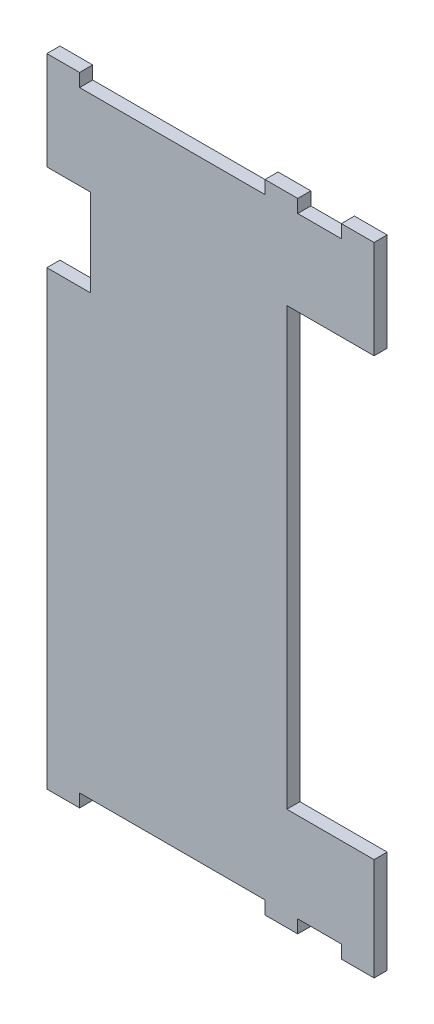
ISO-10303-21;
HEADER;
FILE_DESCRIPTION(('STEP AP214'),'2;1');
FILE_NAME('part.step','',(''),(''),'','','');
FILE_SCHEMA(('AUTOMOTIVE_DESIGN { 1 0 10303 214 1 1 1 1 }'));
ENDSEC;
DATA;
#1=APPLICATION_CONTEXT('core data for automotive mechanical design processes');
#2=APPLICATION_PROTOCOL_DEFINITION('international standard','automotive_design',2000,#1);
#3=PRODUCT_CONTEXT('',#1,'mechanical');
#4=PRODUCT('Part','Part','',(#3));
#5=PRODUCT_RELATED_PRODUCT_CATEGORY('part','',(#4));
#6=PRODUCT_DEFINITION_FORMATION('','',#4);
#7=PRODUCT_DEFINITION_CONTEXT('part definition',#1,'design');
#8=PRODUCT_DEFINITION('design','',#6,#7);
#9=PRODUCT_DEFINITION_SHAPE('','',#8);
#10=(LENGTH_UNIT() NAMED_UNIT(*) SI_UNIT(.MILLI.,.METRE.));
#11=(NAMED_UNIT(*) PLANE_ANGLE_UNIT() SI_UNIT($,.RADIAN.));
#12=(NAMED_UNIT(*) SI_UNIT($,.STERADIAN.) SOLID_ANGLE_UNIT());
#13=UNCERTAINTY_MEASURE_WITH_UNIT(LENGTH_MEASURE(1.E-05),#10,'distance_accuracy_value','');
#14=(GEOMETRIC_REPRESENTATION_CONTEXT(3) GLOBAL_UNCERTAINTY_ASSIGNED_CONTEXT((#13)) GLOBAL_UNIT_ASSIGNED_CONTEXT((#10,
#11,#12)) REPRESENTATION_CONTEXT('',''));
#15=CARTESIAN_POINT('',(0.,0.,0.));
#16=DIRECTION('',(0.,0.,1.));
#17=DIRECTION('',(1.,0.,0.));
#18=AXIS2_PLACEMENT_3D('',#15,#16,#17);
#19=CARTESIAN_POINT('',(0.,0.,6.));
#20=DIRECTION('',(1.,0.,0.));
#21=DIRECTION('',(0.,0.,-1.));
#22=AXIS2_PLACEMENT_3D('',#19,#20,#21);
#23=PLANE('',#22);
#24=DIRECTION('',(0.,-1.,0.));
#25=VECTOR('',#24,1.);
#26=CARTESIAN_POINT('',(0.,0.,6.));
#27=LINE('',#26,#25);
#28=CARTESIAN_POINT('',(0.,207.,6.));
#29=VERTEX_POINT('',#28);
#30=CARTESIAN_POINT('',(0.,0.,6.));
#31=VERTEX_POINT('',#30);
#32=EDGE_CURVE('E243',#29,#31,#27,.T.);
#33=ORIENTED_EDGE('',*,*,#32,.F.);
#34=DIRECTION('',(0.,0.,-1.));
#35=VECTOR('',#34,1.);
#36=CARTESIAN_POINT('',(0.,207.,6.));
#37=LINE('',#36,#35);
#38=CARTESIAN_POINT('',(0.,207.,0.));
#39=VERTEX_POINT('',#38);
#40=EDGE_CURVE('E422',#29,#39,#37,.T.);
#41=ORIENTED_EDGE('',*,*,#40,.T.);
#42=DIRECTION('',(0.,-1.,0.));
#43=VECTOR('',#42,1.);
#44=CARTESIAN_POINT('',(0.,0.,0.));
#45=LINE('',#44,#43);
#46=CARTESIAN_POINT('',(0.,0.,0.));
#47=VERTEX_POINT('',#46);
#48=EDGE_CURVE('E265',#39,#47,#45,.T.);
#49=ORIENTED_EDGE('',*,*,#48,.T.);
#50=DIRECTION('',(0.,0.,-1.));
#51=VECTOR('',#50,1.);
#52=CARTESIAN_POINT('',(0.,0.,6.));
#53=LINE('',#52,#51);
#54=EDGE_CURVE('E11',#31,#47,#53,.T.);
#55=ORIENTED_EDGE('',*,*,#54,.F.);
#56=EDGE_LOOP('',(#33,#41,#49,#55));
#57=FACE_BOUND('',#56,.T.);
#58=ADVANCED_FACE('F33',(#57),#23,.F.);
#59=CARTESIAN_POINT('',(0.,0.,6.));
#60=DIRECTION('',(0.,1.,0.));
#61=DIRECTION('',(0.,0.,1.));
#62=AXIS2_PLACEMENT_3D('',#59,#60,#61);
#63=PLANE('',#62);
#64=DIRECTION('',(1.,0.,0.));
#65=VECTOR('',#64,1.);
#66=CARTESIAN_POINT('',(0.,0.,6.));
#67=LINE('',#66,#65);
#68=CARTESIAN_POINT('',(100.,0.,6.));
#69=VERTEX_POINT('',#68);
#70=CARTESIAN_POINT('',(115.,0.,6.));
#71=VERTEX_POINT('',#70);
#72=EDGE_CURVE('E245',#69,#71,#67,.T.);
#73=ORIENTED_EDGE('',*,*,#72,.F.);
#74=DIRECTION('',(0.,0.,-1.));
#75=VECTOR('',#74,1.);
#76=CARTESIAN_POINT('',(100.,0.,6.));
#77=LINE('',#76,#75);
#78=CARTESIAN_POINT('',(100.,0.,0.));
#79=VERTEX_POINT('',#78);
#80=EDGE_CURVE('E406',#69,#79,#77,.T.);
#81=ORIENTED_EDGE('',*,*,#80,.T.);
#82=DIRECTION('',(1.,0.,0.));
#83=VECTOR('',#82,1.);
#84=CARTESIAN_POINT('',(0.,0.,0.));
#85=LINE('',#84,#83);
#86=CARTESIAN_POINT('',(115.,0.,0.));
#87=VERTEX_POINT('',#86);
#88=EDGE_CURVE('E270',#79,#87,#85,.T.);
#89=ORIENTED_EDGE('',*,*,#88,.T.);
#90=DIRECTION('',(0.,0.,-1.));
#91=VECTOR('',#90,1.);
#92=CARTESIAN_POINT('',(115.,0.,6.));
#93=LINE('',#92,#91);
#94=EDGE_CURVE('E382',#71,#87,#93,.T.);
#95=ORIENTED_EDGE('',*,*,#94,.F.);
#96=EDGE_LOOP('',(#73,#81,#89,#95));
#97=FACE_BOUND('',#96,.T.);
#98=ADVANCED_FACE('F470',(#97),#63,.F.);
#99=CARTESIAN_POINT('',(135.,0.,6.));
#100=VERTEX_POINT('',#99);
#101=CARTESIAN_POINT('',(150.,0.,6.));
#102=VERTEX_POINT('',#101);
#103=EDGE_CURVE('E242',#100,#102,#67,.T.);
#104=ORIENTED_EDGE('',*,*,#103,.F.);
#105=DIRECTION('',(0.,0.,-1.));
#106=VECTOR('',#105,1.);
#107=CARTESIAN_POINT('',(135.,0.,6.));
#108=LINE('',#107,#106);
#109=CARTESIAN_POINT('',(135.,0.,0.));
#110=VERTEX_POINT('',#109);
#111=EDGE_CURVE('E379',#100,#110,#108,.T.);
#112=ORIENTED_EDGE('',*,*,#111,.T.);
#113=CARTESIAN_POINT('',(150.,0.,0.));
#114=VERTEX_POINT('',#113);
#115=EDGE_CURVE('E264',#110,#114,#85,.T.);
#116=ORIENTED_EDGE('',*,*,#115,.T.);
#117=DIRECTION('',(0.,0.,-1.));
#118=VECTOR('',#117,1.);
#119=CARTESIAN_POINT('',(150.,0.,6.));
#120=LINE('',#119,#118);
#121=EDGE_CURVE('E41',#102,#114,#120,.T.);
#122=ORIENTED_EDGE('',*,*,#121,.F.);
#123=EDGE_LOOP('',(#104,#112,#116,#122));
#124=FACE_BOUND('',#123,.T.);
#125=ADVANCED_FACE('F481',(#124),#63,.F.);
#126=CARTESIAN_POINT('',(0.,292.,6.));
#127=DIRECTION('',(0.,-1.,0.));
#128=DIRECTION('',(0.,0.,-1.));
#129=AXIS2_PLACEMENT_3D('',#126,#127,#128);
#130=PLANE('',#129);
#131=DIRECTION('',(-1.,0.,0.));
#132=VECTOR('',#131,1.);
#133=CARTESIAN_POINT('',(0.,292.,0.));
#134=LINE('',#133,#132);
#135=CARTESIAN_POINT('',(115.,292.,0.));
#136=VERTEX_POINT('',#135);
#137=CARTESIAN_POINT('',(100.,292.,0.));
#138=VERTEX_POINT('',#137);
#139=EDGE_CURVE('E277',#136,#138,#134,.T.);
#140=ORIENTED_EDGE('',*,*,#139,.T.);
#141=DIRECTION('',(0.,0.,-1.));
#142=VECTOR('',#141,1.);
#143=CARTESIAN_POINT('',(100.,292.,6.));
#144=LINE('',#143,#142);
#145=CARTESIAN_POINT('',(100.,292.,6.));
#146=VERTEX_POINT('',#145);
#147=EDGE_CURVE('E346',#146,#138,#144,.T.);
#148=ORIENTED_EDGE('',*,*,#147,.F.);
#149=DIRECTION('',(-1.,0.,0.));
#150=VECTOR('',#149,1.);
#151=CARTESIAN_POINT('',(0.,292.,6.));
#152=LINE('',#151,#150);
#153=CARTESIAN_POINT('',(115.,292.,6.));
#154=VERTEX_POINT('',#153);
#155=EDGE_CURVE('E262',#154,#146,#152,.T.);
#156=ORIENTED_EDGE('',*,*,#155,.F.);
#157=DIRECTION('',(0.,0.,-1.));
#158=VECTOR('',#157,1.);
#159=CARTESIAN_POINT('',(115.,292.,6.));
#160=LINE('',#159,#158);
#161=EDGE_CURVE('E307',#154,#136,#160,.T.);
#162=ORIENTED_EDGE('',*,*,#161,.T.);
#163=EDGE_LOOP('',(#140,#148,#156,#162));
#164=FACE_BOUND('',#163,.T.);
#165=ADVANCED_FACE('F512',(#164),#130,.F.);
#166=CARTESIAN_POINT('',(150.,292.,0.));
#167=VERTEX_POINT('',#166);
#168=CARTESIAN_POINT('',(135.,292.,0.));
#169=VERTEX_POINT('',#168);
#170=EDGE_CURVE('E248',#167,#169,#134,.T.);
#171=ORIENTED_EDGE('',*,*,#170,.T.);
#172=DIRECTION('',(0.,0.,-1.));
#173=VECTOR('',#172,1.);
#174=CARTESIAN_POINT('',(135.,292.,6.));
#175=LINE('',#174,#173);
#176=CARTESIAN_POINT('',(135.,292.,6.));
#177=VERTEX_POINT('',#176);
#178=EDGE_CURVE('E303',#177,#169,#175,.T.);
#179=ORIENTED_EDGE('',*,*,#178,.F.);
#180=CARTESIAN_POINT('',(150.,292.,6.));
#181=VERTEX_POINT('',#180);
#182=EDGE_CURVE('E258',#181,#177,#152,.T.);
#183=ORIENTED_EDGE('',*,*,#182,.F.);
#184=DIRECTION('',(0.,0.,-1.));
#185=VECTOR('',#184,1.);
#186=CARTESIAN_POINT('',(150.,292.,6.));
#187=LINE('',#186,#185);
#188=EDGE_CURVE('E279',#181,#167,#187,.T.);
#189=ORIENTED_EDGE('',*,*,#188,.T.);
#190=EDGE_LOOP('',(#171,#179,#183,#189));
#191=FACE_BOUND('',#190,.T.);
#192=ADVANCED_FACE('F506',(#191),#130,.F.);
#193=CARTESIAN_POINT('',(150.,0.,6.));
#194=DIRECTION('',(-1.,0.,0.));
#195=DIRECTION('',(0.,0.,1.));
#196=AXIS2_PLACEMENT_3D('',#193,#194,#195);
#197=PLANE('',#196);
#198=DIRECTION('',(0.,1.,0.));
#199=VECTOR('',#198,1.);
#200=CARTESIAN_POINT('',(150.,0.,6.));
#201=LINE('',#200,#199);
#202=CARTESIAN_POINT('',(150.,247.,6.));
#203=VERTEX_POINT('',#202);
#204=EDGE_CURVE('E254',#203,#181,#201,.T.);
#205=ORIENTED_EDGE('',*,*,#204,.F.);
#206=DIRECTION('',(0.,0.,-1.));
#207=VECTOR('',#206,1.);
#208=CARTESIAN_POINT('',(150.,247.,6.));
#209=LINE('',#208,#207);
#210=CARTESIAN_POINT('',(150.,247.,0.));
#211=VERTEX_POINT('',#210);
#212=EDGE_CURVE('E315',#203,#211,#209,.T.);
#213=ORIENTED_EDGE('',*,*,#212,.T.);
#214=DIRECTION('',(0.,1.,0.));
#215=VECTOR('',#214,1.);
#216=CARTESIAN_POINT('',(150.,0.,0.));
#217=LINE('',#216,#215);
#218=EDGE_CURVE('E269',#211,#167,#217,.T.);
#219=ORIENTED_EDGE('',*,*,#218,.T.);
#220=ORIENTED_EDGE('',*,*,#188,.F.);
#221=EDGE_LOOP('',(#205,#213,#219,#220));
#222=FACE_BOUND('',#221,.T.);
#223=ADVANCED_FACE('F501',(#222),#197,.F.);
#224=CARTESIAN_POINT('',(0.,292.,0.));
#225=VERTEX_POINT('',#224);
#226=CARTESIAN_POINT('',(0.,247.,0.));
#227=VERTEX_POINT('',#226);
#228=EDGE_CURVE('E234',#225,#227,#45,.T.);
#229=ORIENTED_EDGE('',*,*,#228,.T.);
#230=DIRECTION('',(0.,0.,-1.));
#231=VECTOR('',#230,1.);
#232=CARTESIAN_POINT('',(0.,247.,6.));
#233=LINE('',#232,#231);
#234=CARTESIAN_POINT('',(0.,247.,6.));
#235=VERTEX_POINT('',#234);
#236=EDGE_CURVE('E48',#235,#227,#233,.T.);
#237=ORIENTED_EDGE('',*,*,#236,.F.);
#238=CARTESIAN_POINT('',(0.,292.,6.));
#239=VERTEX_POINT('',#238);
#240=EDGE_CURVE('E232',#239,#235,#27,.T.);
#241=ORIENTED_EDGE('',*,*,#240,.F.);
#242=DIRECTION('',(0.,0.,-1.));
#243=VECTOR('',#242,1.);
#244=CARTESIAN_POINT('',(0.,292.,6.));
#245=LINE('',#244,#243);
#246=EDGE_CURVE('E261',#239,#225,#245,.T.);
#247=ORIENTED_EDGE('',*,*,#246,.T.);
#248=EDGE_LOOP('',(#229,#237,#241,#247));
#249=FACE_BOUND('',#248,.T.);
#250=ADVANCED_FACE('F35',(#249),#23,.F.);
#251=CARTESIAN_POINT('',(15.,0.,0.));
#252=VERTEX_POINT('',#251);
#253=EDGE_CURVE('E266',#47,#252,#85,.T.);
#254=ORIENTED_EDGE('',*,*,#253,.T.);
#255=DIRECTION('',(0.,0.,-1.));
#256=VECTOR('',#255,1.);
#257=CARTESIAN_POINT('',(15.,0.,6.));
#258=LINE('',#257,#256);
#259=CARTESIAN_POINT('',(15.,0.,6.));
#260=VERTEX_POINT('',#259);
#261=EDGE_CURVE('E56',#260,#252,#258,.T.);
#262=ORIENTED_EDGE('',*,*,#261,.F.);
#263=EDGE_CURVE('E247',#31,#260,#67,.T.);
#264=ORIENTED_EDGE('',*,*,#263,.F.);
#265=ORIENTED_EDGE('',*,*,#54,.T.);
#266=EDGE_LOOP('',(#254,#262,#264,#265));
#267=FACE_BOUND('',#266,.T.);
#268=ADVANCED_FACE('F457',(#267),#63,.F.);
#269=CARTESIAN_POINT('',(150.,47.,0.));
#270=VERTEX_POINT('',#269);
#271=EDGE_CURVE('E271',#114,#270,#217,.T.);
#272=ORIENTED_EDGE('',*,*,#271,.T.);
#273=DIRECTION('',(0.,0.,-1.));
#274=VECTOR('',#273,1.);
#275=CARTESIAN_POINT('',(150.,47.,6.));
#276=LINE('',#275,#274);
#277=CARTESIAN_POINT('',(150.,47.,6.));
#278=VERTEX_POINT('',#277);
#279=EDGE_CURVE('E250',#278,#270,#276,.T.);
#280=ORIENTED_EDGE('',*,*,#279,.F.);
#281=EDGE_CURVE('E255',#102,#278,#201,.T.);
#282=ORIENTED_EDGE('',*,*,#281,.F.);
#283=ORIENTED_EDGE('',*,*,#121,.T.);
#284=EDGE_LOOP('',(#272,#280,#282,#283));
#285=FACE_BOUND('',#284,.T.);
#286=ADVANCED_FACE('F286',(#285),#197,.F.);
#287=CARTESIAN_POINT('',(15.,292.,6.));
#288=VERTEX_POINT('',#287);
#289=EDGE_CURVE('E240',#288,#239,#152,.T.);
#290=ORIENTED_EDGE('',*,*,#289,.F.);
#291=DIRECTION('',(0.,0.,-1.));
#292=VECTOR('',#291,1.);
#293=CARTESIAN_POINT('',(15.,292.,6.));
#294=LINE('',#293,#292);
#295=CARTESIAN_POINT('',(15.,292.,0.));
#296=VERTEX_POINT('',#295);
#297=EDGE_CURVE('E360',#288,#296,#294,.T.);
#298=ORIENTED_EDGE('',*,*,#297,.T.);
#299=EDGE_CURVE('E274',#296,#225,#134,.T.);
#300=ORIENTED_EDGE('',*,*,#299,.T.);
#301=ORIENTED_EDGE('',*,*,#246,.F.);
#302=EDGE_LOOP('',(#290,#298,#300,#301));
#303=FACE_BOUND('',#302,.T.);
#304=ADVANCED_FACE('F515',(#303),#130,.F.);
#305=CARTESIAN_POINT('',(0.,0.,6.));
#306=DIRECTION('',(0.,0.,-1.));
#307=DIRECTION('',(-1.,0.,0.));
#308=AXIS2_PLACEMENT_3D('',#305,#306,#307);
#309=PLANE('',#308);
#310=DIRECTION('',(0.,-1.,0.));
#311=VECTOR('',#310,1.);
#312=CARTESIAN_POINT('',(20.,247.,6.));
#313=LINE('',#312,#311);
#314=CARTESIAN_POINT('',(20.,247.,6.));
#315=VERTEX_POINT('',#314);
#316=CARTESIAN_POINT('',(20.,207.,6.));
#317=VERTEX_POINT('',#316);
#318=EDGE_CURVE('E225',#315,#317,#313,.T.);
#319=ORIENTED_EDGE('',*,*,#318,.T.);
#320=DIRECTION('',(-1.,0.,0.));
#321=VECTOR('',#320,1.);
#322=CARTESIAN_POINT('',(0.,207.,6.));
#323=LINE('',#322,#321);
#324=EDGE_CURVE('E235',#317,#29,#323,.T.);
#325=ORIENTED_EDGE('',*,*,#324,.T.);
#326=ORIENTED_EDGE('',*,*,#32,.T.);
#327=ORIENTED_EDGE('',*,*,#263,.T.);
#328=DIRECTION('',(0.,1.,0.));
#329=VECTOR('',#328,1.);
#330=CARTESIAN_POINT('',(15.,0.,6.));
#331=LINE('',#330,#329);
#332=CARTESIAN_POINT('',(15.,6.,6.));
#333=VERTEX_POINT('',#332);
#334=EDGE_CURVE('E425',#260,#333,#331,.T.);
#335=ORIENTED_EDGE('',*,*,#334,.T.);
#336=DIRECTION('',(1.,0.,0.));
#337=VECTOR('',#336,1.);
#338=CARTESIAN_POINT('',(100.,6.,6.));
#339=LINE('',#338,#337);
#340=CARTESIAN_POINT('',(100.,6.,6.));
#341=VERTEX_POINT('',#340);
#342=EDGE_CURVE('E409',#333,#341,#339,.T.);
#343=ORIENTED_EDGE('',*,*,#342,.T.);
#344=DIRECTION('',(0.,-1.,0.));
#345=VECTOR('',#344,1.);
#346=CARTESIAN_POINT('',(100.,0.,6.));
#347=LINE('',#346,#345);
#348=EDGE_CURVE('E417',#341,#69,#347,.T.);
#349=ORIENTED_EDGE('',*,*,#348,.T.);
#350=ORIENTED_EDGE('',*,*,#72,.T.);
#351=DIRECTION('',(0.,1.,0.));
#352=VECTOR('',#351,1.);
#353=CARTESIAN_POINT('',(115.,0.,6.));
#354=LINE('',#353,#352);
#355=CARTESIAN_POINT('',(115.,6.,6.));
#356=VERTEX_POINT('',#355);
#357=EDGE_CURVE('E401',#71,#356,#354,.T.);
#358=ORIENTED_EDGE('',*,*,#357,.T.);
#359=DIRECTION('',(1.,0.,0.));
#360=VECTOR('',#359,1.);
#361=CARTESIAN_POINT('',(135.,6.,6.));
#362=LINE('',#361,#360);
#363=CARTESIAN_POINT('',(135.,6.,6.));
#364=VERTEX_POINT('',#363);
#365=EDGE_CURVE('E383',#356,#364,#362,.T.);
#366=ORIENTED_EDGE('',*,*,#365,.T.);
#367=DIRECTION('',(0.,-1.,0.));
#368=VECTOR('',#367,1.);
#369=CARTESIAN_POINT('',(135.,0.,6.));
#370=LINE('',#369,#368);
#371=EDGE_CURVE('E392',#364,#100,#370,.T.);
#372=ORIENTED_EDGE('',*,*,#371,.T.);
#373=ORIENTED_EDGE('',*,*,#103,.T.);
#374=ORIENTED_EDGE('',*,*,#281,.T.);
#375=DIRECTION('',(-1.,0.,0.));
#376=VECTOR('',#375,1.);
#377=CARTESIAN_POINT('',(150.,47.,6.));
#378=LINE('',#377,#376);
#379=CARTESIAN_POINT('',(110.,47.,6.));
#380=VERTEX_POINT('',#379);
#381=EDGE_CURVE('E314',#278,#380,#378,.T.);
#382=ORIENTED_EDGE('',*,*,#381,.T.);
#383=DIRECTION('',(0.,1.,0.));
#384=VECTOR('',#383,1.);
#385=CARTESIAN_POINT('',(110.,247.,6.));
#386=LINE('',#385,#384);
#387=CARTESIAN_POINT('',(110.,247.,6.));
#388=VERTEX_POINT('',#387);
#389=EDGE_CURVE('E323',#380,#388,#386,.T.);
#390=ORIENTED_EDGE('',*,*,#389,.T.);
#391=DIRECTION('',(1.,0.,0.));
#392=VECTOR('',#391,1.);
#393=CARTESIAN_POINT('',(150.,247.,6.));
#394=LINE('',#393,#392);
#395=EDGE_CURVE('E310',#388,#203,#394,.T.);
#396=ORIENTED_EDGE('',*,*,#395,.T.);
#397=ORIENTED_EDGE('',*,*,#204,.T.);
#398=ORIENTED_EDGE('',*,*,#182,.T.);
#399=DIRECTION('',(0.,-1.,0.));
#400=VECTOR('',#399,1.);
#401=CARTESIAN_POINT('',(135.,292.,6.));
#402=LINE('',#401,#400);
#403=CARTESIAN_POINT('',(135.,286.,6.));
#404=VERTEX_POINT('',#403);
#405=EDGE_CURVE('E340',#177,#404,#402,.T.);
#406=ORIENTED_EDGE('',*,*,#405,.T.);
#407=DIRECTION('',(-1.,0.,0.));
#408=VECTOR('',#407,1.);
#409=CARTESIAN_POINT('',(135.,286.,6.));
#410=LINE('',#409,#408);
#411=CARTESIAN_POINT('',(115.,286.,6.));
#412=VERTEX_POINT('',#411);
#413=EDGE_CURVE('E349',#404,#412,#410,.T.);
#414=ORIENTED_EDGE('',*,*,#413,.T.);
#415=DIRECTION('',(0.,1.,0.));
#416=VECTOR('',#415,1.);
#417=CARTESIAN_POINT('',(115.,292.,6.));
#418=LINE('',#417,#416);
#419=EDGE_CURVE('E334',#412,#154,#418,.T.);
#420=ORIENTED_EDGE('',*,*,#419,.T.);
#421=ORIENTED_EDGE('',*,*,#155,.T.);
#422=DIRECTION('',(0.,-1.,0.));
#423=VECTOR('',#422,1.);
#424=CARTESIAN_POINT('',(100.,292.,6.));
#425=LINE('',#424,#423);
#426=CARTESIAN_POINT('',(100.,286.,6.));
#427=VERTEX_POINT('',#426);
#428=EDGE_CURVE('E366',#146,#427,#425,.T.);
#429=ORIENTED_EDGE('',*,*,#428,.T.);
#430=DIRECTION('',(-1.,0.,0.));
#431=VECTOR('',#430,1.);
#432=CARTESIAN_POINT('',(100.,286.,6.));
#433=LINE('',#432,#431);
#434=CARTESIAN_POINT('',(15.,286.,6.));
#435=VERTEX_POINT('',#434);
#436=EDGE_CURVE('E374',#427,#435,#433,.T.);
#437=ORIENTED_EDGE('',*,*,#436,.T.);
#438=DIRECTION('',(0.,1.,0.));
#439=VECTOR('',#438,1.);
#440=CARTESIAN_POINT('',(15.,292.,6.));
#441=LINE('',#440,#439);
#442=EDGE_CURVE('E358',#435,#288,#441,.T.);
#443=ORIENTED_EDGE('',*,*,#442,.T.);
#444=ORIENTED_EDGE('',*,*,#289,.T.);
#445=ORIENTED_EDGE('',*,*,#240,.T.);
#446=DIRECTION('',(1.,0.,0.));
#447=VECTOR('',#446,1.);
#448=CARTESIAN_POINT('',(0.,247.,6.));
#449=LINE('',#448,#447);
#450=EDGE_CURVE('E218',#235,#315,#449,.T.);
#451=ORIENTED_EDGE('',*,*,#450,.T.);
#452=EDGE_LOOP('',(#319,#325,#326,#327,#335,#343,#349,#350,#358,#366,#372,#373,#374,#382,#390,
#396,#397,#398,#406,#414,#420,#421,#429,#437,#443,#444,#445,#451));
#453=FACE_BOUND('',#452,.T.);
#454=ADVANCED_FACE('F237',(#453),#309,.F.);
#455=CARTESIAN_POINT('',(0.,0.,0.));
#456=DIRECTION('',(0.,0.,-1.));
#457=DIRECTION('',(-1.,0.,0.));
#458=AXIS2_PLACEMENT_3D('',#455,#456,#457);
#459=PLANE('',#458);
#460=DIRECTION('',(-1.,0.,0.));
#461=VECTOR('',#460,1.);
#462=CARTESIAN_POINT('',(0.,207.,0.));
#463=LINE('',#462,#461);
#464=CARTESIAN_POINT('',(20.,207.,0.));
#465=VERTEX_POINT('',#464);
#466=EDGE_CURVE('E226',#465,#39,#463,.T.);
#467=ORIENTED_EDGE('',*,*,#466,.F.);
#468=DIRECTION('',(0.,-1.,0.));
#469=VECTOR('',#468,1.);
#470=CARTESIAN_POINT('',(20.,247.,0.));
#471=LINE('',#470,#469);
#472=CARTESIAN_POINT('',(20.,247.,0.));
#473=VERTEX_POINT('',#472);
#474=EDGE_CURVE('E436',#473,#465,#471,.T.);
#475=ORIENTED_EDGE('',*,*,#474,.F.);
#476=DIRECTION('',(1.,0.,0.));
#477=VECTOR('',#476,1.);
#478=CARTESIAN_POINT('',(0.,247.,0.));
#479=LINE('',#478,#477);
#480=EDGE_CURVE('E439',#227,#473,#479,.T.);
#481=ORIENTED_EDGE('',*,*,#480,.F.);
#482=ORIENTED_EDGE('',*,*,#228,.F.);
#483=ORIENTED_EDGE('',*,*,#299,.F.);
#484=DIRECTION('',(0.,1.,0.));
#485=VECTOR('',#484,1.);
#486=CARTESIAN_POINT('',(15.,292.,0.));
#487=LINE('',#486,#485);
#488=CARTESIAN_POINT('',(15.,286.,0.));
#489=VERTEX_POINT('',#488);
#490=EDGE_CURVE('E364',#489,#296,#487,.T.);
#491=ORIENTED_EDGE('',*,*,#490,.F.);
#492=DIRECTION('',(-1.,0.,0.));
#493=VECTOR('',#492,1.);
#494=CARTESIAN_POINT('',(100.,286.,0.));
#495=LINE('',#494,#493);
#496=CARTESIAN_POINT('',(100.,286.,0.));
#497=VERTEX_POINT('',#496);
#498=EDGE_CURVE('E367',#497,#489,#495,.T.);
#499=ORIENTED_EDGE('',*,*,#498,.F.);
#500=DIRECTION('',(0.,-1.,0.));
#501=VECTOR('',#500,1.);
#502=CARTESIAN_POINT('',(100.,292.,0.));
#503=LINE('',#502,#501);
#504=EDGE_CURVE('E370',#138,#497,#503,.T.);
#505=ORIENTED_EDGE('',*,*,#504,.F.);
#506=ORIENTED_EDGE('',*,*,#139,.F.);
#507=DIRECTION('',(0.,1.,0.));
#508=VECTOR('',#507,1.);
#509=CARTESIAN_POINT('',(115.,292.,0.));
#510=LINE('',#509,#508);
#511=CARTESIAN_POINT('',(115.,286.,0.));
#512=VERTEX_POINT('',#511);
#513=EDGE_CURVE('E338',#512,#136,#510,.T.);
#514=ORIENTED_EDGE('',*,*,#513,.F.);
#515=DIRECTION('',(-1.,0.,0.));
#516=VECTOR('',#515,1.);
#517=CARTESIAN_POINT('',(135.,286.,0.));
#518=LINE('',#517,#516);
#519=CARTESIAN_POINT('',(135.,286.,0.));
#520=VERTEX_POINT('',#519);
#521=EDGE_CURVE('E341',#520,#512,#518,.T.);
#522=ORIENTED_EDGE('',*,*,#521,.F.);
#523=DIRECTION('',(0.,-1.,0.));
#524=VECTOR('',#523,1.);
#525=CARTESIAN_POINT('',(135.,292.,0.));
#526=LINE('',#525,#524);
#527=EDGE_CURVE('E344',#169,#520,#526,.T.);
#528=ORIENTED_EDGE('',*,*,#527,.F.);
#529=ORIENTED_EDGE('',*,*,#170,.F.);
#530=ORIENTED_EDGE('',*,*,#218,.F.);
#531=DIRECTION('',(1.,0.,0.));
#532=VECTOR('',#531,1.);
#533=CARTESIAN_POINT('',(150.,247.,0.));
#534=LINE('',#533,#532);
#535=CARTESIAN_POINT('',(110.,247.,0.));
#536=VERTEX_POINT('',#535);
#537=EDGE_CURVE('E305',#536,#211,#534,.T.);
#538=ORIENTED_EDGE('',*,*,#537,.F.);
#539=DIRECTION('',(0.,1.,0.));
#540=VECTOR('',#539,1.);
#541=CARTESIAN_POINT('',(110.,247.,0.));
#542=LINE('',#541,#540);
#543=CARTESIAN_POINT('',(110.,47.,0.));
#544=VERTEX_POINT('',#543);
#545=EDGE_CURVE('E301',#544,#536,#542,.T.);
#546=ORIENTED_EDGE('',*,*,#545,.F.);
#547=DIRECTION('',(-1.,0.,0.));
#548=VECTOR('',#547,1.);
#549=CARTESIAN_POINT('',(150.,47.,0.));
#550=LINE('',#549,#548);
#551=EDGE_CURVE('E298',#270,#544,#550,.T.);
#552=ORIENTED_EDGE('',*,*,#551,.F.);
#553=ORIENTED_EDGE('',*,*,#271,.F.);
#554=ORIENTED_EDGE('',*,*,#115,.F.);
#555=DIRECTION('',(0.,-1.,0.));
#556=VECTOR('',#555,1.);
#557=CARTESIAN_POINT('',(135.,0.,0.));
#558=LINE('',#557,#556);
#559=CARTESIAN_POINT('',(135.,6.,0.));
#560=VERTEX_POINT('',#559);
#561=EDGE_CURVE('E396',#560,#110,#558,.T.);
#562=ORIENTED_EDGE('',*,*,#561,.F.);
#563=DIRECTION('',(1.,0.,0.));
#564=VECTOR('',#563,1.);
#565=CARTESIAN_POINT('',(135.,6.,0.));
#566=LINE('',#565,#564);
#567=CARTESIAN_POINT('',(115.,6.,0.));
#568=VERTEX_POINT('',#567);
#569=EDGE_CURVE('E389',#568,#560,#566,.T.);
#570=ORIENTED_EDGE('',*,*,#569,.F.);
#571=DIRECTION('',(0.,1.,0.));
#572=VECTOR('',#571,1.);
#573=CARTESIAN_POINT('',(115.,0.,0.));
#574=LINE('',#573,#572);
#575=EDGE_CURVE('E393',#87,#568,#574,.T.);
#576=ORIENTED_EDGE('',*,*,#575,.F.);
#577=ORIENTED_EDGE('',*,*,#88,.F.);
#578=DIRECTION('',(0.,-1.,0.));
#579=VECTOR('',#578,1.);
#580=CARTESIAN_POINT('',(100.,0.,0.));
#581=LINE('',#580,#579);
#582=CARTESIAN_POINT('',(100.,6.,0.));
#583=VERTEX_POINT('',#582);
#584=EDGE_CURVE('E420',#583,#79,#581,.T.);
#585=ORIENTED_EDGE('',*,*,#584,.F.);
#586=DIRECTION('',(1.,0.,0.));
#587=VECTOR('',#586,1.);
#588=CARTESIAN_POINT('',(100.,6.,0.));
#589=LINE('',#588,#587);
#590=CARTESIAN_POINT('',(15.,6.,0.));
#591=VERTEX_POINT('',#590);
#592=EDGE_CURVE('E414',#591,#583,#589,.T.);
#593=ORIENTED_EDGE('',*,*,#592,.F.);
#594=DIRECTION('',(0.,1.,0.));
#595=VECTOR('',#594,1.);
#596=CARTESIAN_POINT('',(15.,0.,0.));
#597=LINE('',#596,#595);
#598=EDGE_CURVE('E418',#252,#591,#597,.T.);
#599=ORIENTED_EDGE('',*,*,#598,.F.);
#600=ORIENTED_EDGE('',*,*,#253,.F.);
#601=ORIENTED_EDGE('',*,*,#48,.F.);
#602=EDGE_LOOP('',(#467,#475,#481,#482,#483,#491,#499,#505,#506,#514,#522,#528,#529,#530,#538,
#546,#552,#553,#554,#562,#570,#576,#577,#585,#593,#599,#600,#601));
#603=FACE_BOUND('',#602,.T.);
#604=ADVANCED_FACE('F294',(#603),#459,.T.);
#605=CARTESIAN_POINT('',(150.,247.,6.));
#606=DIRECTION('',(0.,1.,0.));
#607=DIRECTION('',(0.,0.,1.));
#608=AXIS2_PLACEMENT_3D('',#605,#606,#607);
#609=PLANE('',#608);
#610=ORIENTED_EDGE('',*,*,#537,.T.);
#611=ORIENTED_EDGE('',*,*,#212,.F.);
#612=ORIENTED_EDGE('',*,*,#395,.F.);
#613=DIRECTION('',(0.,0.,-1.));
#614=VECTOR('',#613,1.);
#615=CARTESIAN_POINT('',(110.,247.,6.));
#616=LINE('',#615,#614);
#617=EDGE_CURVE('E318',#388,#536,#616,.T.);
#618=ORIENTED_EDGE('',*,*,#617,.T.);
#619=EDGE_LOOP('',(#610,#611,#612,#618));
#620=FACE_BOUND('',#619,.T.);
#621=ADVANCED_FACE('F562',(#620),#609,.F.);
#622=CARTESIAN_POINT('',(110.,247.,6.));
#623=DIRECTION('',(-1.,0.,0.));
#624=DIRECTION('',(0.,-1.,0.));
#625=AXIS2_PLACEMENT_3D('',#622,#623,#624);
#626=PLANE('',#625);
#627=ORIENTED_EDGE('',*,*,#545,.T.);
#628=ORIENTED_EDGE('',*,*,#617,.F.);
#629=ORIENTED_EDGE('',*,*,#389,.F.);
#630=DIRECTION('',(0.,0.,-1.));
#631=VECTOR('',#630,1.);
#632=CARTESIAN_POINT('',(110.,47.,6.));
#633=LINE('',#632,#631);
#634=EDGE_CURVE('E319',#380,#544,#633,.T.);
#635=ORIENTED_EDGE('',*,*,#634,.T.);
#636=EDGE_LOOP('',(#627,#628,#629,#635));
#637=FACE_BOUND('',#636,.T.);
#638=ADVANCED_FACE('F563',(#637),#626,.F.);
#639=CARTESIAN_POINT('',(150.,47.,6.));
#640=DIRECTION('',(0.,-1.,0.));
#641=DIRECTION('',(0.,0.,-1.));
#642=AXIS2_PLACEMENT_3D('',#639,#640,#641);
#643=PLANE('',#642);
#644=ORIENTED_EDGE('',*,*,#551,.T.);
#645=ORIENTED_EDGE('',*,*,#634,.F.);
#646=ORIENTED_EDGE('',*,*,#381,.F.);
#647=ORIENTED_EDGE('',*,*,#279,.T.);
#648=EDGE_LOOP('',(#644,#645,#646,#647));
#649=FACE_BOUND('',#648,.T.);
#650=ADVANCED_FACE('F565',(#649),#643,.F.);
#651=CARTESIAN_POINT('',(135.,292.,6.));
#652=DIRECTION('',(1.,0.,0.));
#653=DIRECTION('',(0.,0.,-1.));
#654=AXIS2_PLACEMENT_3D('',#651,#652,#653);
#655=PLANE('',#654);
#656=ORIENTED_EDGE('',*,*,#527,.T.);
#657=DIRECTION('',(0.,0.,-1.));
#658=VECTOR('',#657,1.);
#659=CARTESIAN_POINT('',(135.,286.,6.));
#660=LINE('',#659,#658);
#661=EDGE_CURVE('E330',#404,#520,#660,.T.);
#662=ORIENTED_EDGE('',*,*,#661,.F.);
#663=ORIENTED_EDGE('',*,*,#405,.F.);
#664=ORIENTED_EDGE('',*,*,#178,.T.);
#665=EDGE_LOOP('',(#656,#662,#663,#664));
#666=FACE_BOUND('',#665,.T.);
#667=ADVANCED_FACE('F556',(#666),#655,.F.);
#668=CARTESIAN_POINT('',(115.,292.,6.));
#669=DIRECTION('',(-1.,0.,0.));
#670=DIRECTION('',(0.,0.,1.));
#671=AXIS2_PLACEMENT_3D('',#668,#669,#670);
#672=PLANE('',#671);
#673=ORIENTED_EDGE('',*,*,#513,.T.);
#674=ORIENTED_EDGE('',*,*,#161,.F.);
#675=ORIENTED_EDGE('',*,*,#419,.F.);
#676=DIRECTION('',(0.,0.,-1.));
#677=VECTOR('',#676,1.);
#678=CARTESIAN_POINT('',(115.,286.,6.));
#679=LINE('',#678,#677);
#680=EDGE_CURVE('E333',#412,#512,#679,.T.);
#681=ORIENTED_EDGE('',*,*,#680,.T.);
#682=EDGE_LOOP('',(#673,#674,#675,#681));
#683=FACE_BOUND('',#682,.T.);
#684=ADVANCED_FACE('F549',(#683),#672,.F.);
#685=CARTESIAN_POINT('',(135.,286.,6.));
#686=DIRECTION('',(0.,-1.,0.));
#687=DIRECTION('',(0.,0.,-1.));
#688=AXIS2_PLACEMENT_3D('',#685,#686,#687);
#689=PLANE('',#688);
#690=ORIENTED_EDGE('',*,*,#521,.T.);
#691=ORIENTED_EDGE('',*,*,#680,.F.);
#692=ORIENTED_EDGE('',*,*,#413,.F.);
#693=ORIENTED_EDGE('',*,*,#661,.T.);
#694=EDGE_LOOP('',(#690,#691,#692,#693));
#695=FACE_BOUND('',#694,.T.);
#696=ADVANCED_FACE('F554',(#695),#689,.F.);
#697=CARTESIAN_POINT('',(100.,292.,6.));
#698=DIRECTION('',(1.,0.,0.));
#699=DIRECTION('',(0.,0.,-1.));
#700=AXIS2_PLACEMENT_3D('',#697,#698,#699);
#701=PLANE('',#700);
#702=ORIENTED_EDGE('',*,*,#504,.T.);
#703=DIRECTION('',(0.,0.,-1.));
#704=VECTOR('',#703,1.);
#705=CARTESIAN_POINT('',(100.,286.,6.));
#706=LINE('',#705,#704);
#707=EDGE_CURVE('E354',#427,#497,#706,.T.);
#708=ORIENTED_EDGE('',*,*,#707,.F.);
#709=ORIENTED_EDGE('',*,*,#428,.F.);
#710=ORIENTED_EDGE('',*,*,#147,.T.);
#711=EDGE_LOOP('',(#702,#708,#709,#710));
#712=FACE_BOUND('',#711,.T.);
#713=ADVANCED_FACE('F545',(#712),#701,.F.);
#714=CARTESIAN_POINT('',(15.,292.,6.));
#715=DIRECTION('',(-1.,0.,0.));
#716=DIRECTION('',(0.,-1.,0.));
#717=AXIS2_PLACEMENT_3D('',#714,#715,#716);
#718=PLANE('',#717);
#719=ORIENTED_EDGE('',*,*,#490,.T.);
#720=ORIENTED_EDGE('',*,*,#297,.F.);
#721=ORIENTED_EDGE('',*,*,#442,.F.);
#722=DIRECTION('',(0.,0.,-1.));
#723=VECTOR('',#722,1.);
#724=CARTESIAN_POINT('',(15.,286.,6.));
#725=LINE('',#724,#723);
#726=EDGE_CURVE('E357',#435,#489,#725,.T.);
#727=ORIENTED_EDGE('',*,*,#726,.T.);
#728=EDGE_LOOP('',(#719,#720,#721,#727));
#729=FACE_BOUND('',#728,.T.);
#730=ADVANCED_FACE('F491',(#729),#718,.F.);
#731=CARTESIAN_POINT('',(100.,286.,6.));
#732=DIRECTION('',(0.,-1.,0.));
#733=DIRECTION('',(0.,0.,-1.));
#734=AXIS2_PLACEMENT_3D('',#731,#732,#733);
#735=PLANE('',#734);
#736=ORIENTED_EDGE('',*,*,#498,.T.);
#737=ORIENTED_EDGE('',*,*,#726,.F.);
#738=ORIENTED_EDGE('',*,*,#436,.F.);
#739=ORIENTED_EDGE('',*,*,#707,.T.);
#740=EDGE_LOOP('',(#736,#737,#738,#739));
#741=FACE_BOUND('',#740,.T.);
#742=ADVANCED_FACE('F484',(#741),#735,.F.);
#743=CARTESIAN_POINT('',(135.,0.,6.));
#744=DIRECTION('',(1.,0.,0.));
#745=DIRECTION('',(0.,0.,-1.));
#746=AXIS2_PLACEMENT_3D('',#743,#744,#745);
#747=PLANE('',#746);
#748=ORIENTED_EDGE('',*,*,#561,.T.);
#749=ORIENTED_EDGE('',*,*,#111,.F.);
#750=ORIENTED_EDGE('',*,*,#371,.F.);
#751=DIRECTION('',(0.,0.,-1.));
#752=VECTOR('',#751,1.);
#753=CARTESIAN_POINT('',(135.,6.,6.));
#754=LINE('',#753,#752);
#755=EDGE_CURVE('E372',#364,#560,#754,.T.);
#756=ORIENTED_EDGE('',*,*,#755,.T.);
#757=EDGE_LOOP('',(#748,#749,#750,#756));
#758=FACE_BOUND('',#757,.T.);
#759=ADVANCED_FACE('F482',(#758),#747,.F.);
#760=CARTESIAN_POINT('',(135.,6.,6.));
#761=DIRECTION('',(0.,1.,0.));
#762=DIRECTION('',(0.,0.,1.));
#763=AXIS2_PLACEMENT_3D('',#760,#761,#762);
#764=PLANE('',#763);
#765=ORIENTED_EDGE('',*,*,#569,.T.);
#766=ORIENTED_EDGE('',*,*,#755,.F.);
#767=ORIENTED_EDGE('',*,*,#365,.F.);
#768=DIRECTION('',(0.,0.,-1.));
#769=VECTOR('',#768,1.);
#770=CARTESIAN_POINT('',(115.,6.,6.));
#771=LINE('',#770,#769);
#772=EDGE_CURVE('E386',#356,#568,#771,.T.);
#773=ORIENTED_EDGE('',*,*,#772,.T.);
#774=EDGE_LOOP('',(#765,#766,#767,#773));
#775=FACE_BOUND('',#774,.T.);
#776=ADVANCED_FACE('F477',(#775),#764,.F.);
#777=CARTESIAN_POINT('',(115.,0.,6.));
#778=DIRECTION('',(-1.,0.,0.));
#779=DIRECTION('',(0.,0.,1.));
#780=AXIS2_PLACEMENT_3D('',#777,#778,#779);
#781=PLANE('',#780);
#782=ORIENTED_EDGE('',*,*,#575,.T.);
#783=ORIENTED_EDGE('',*,*,#772,.F.);
#784=ORIENTED_EDGE('',*,*,#357,.F.);
#785=ORIENTED_EDGE('',*,*,#94,.T.);
#786=EDGE_LOOP('',(#782,#783,#784,#785));
#787=FACE_BOUND('',#786,.T.);
#788=ADVANCED_FACE('F474',(#787),#781,.F.);
#789=CARTESIAN_POINT('',(100.,0.,6.));
#790=DIRECTION('',(1.,0.,0.));
#791=DIRECTION('',(0.,0.,-1.));
#792=AXIS2_PLACEMENT_3D('',#789,#790,#791);
#793=PLANE('',#792);
#794=ORIENTED_EDGE('',*,*,#584,.T.);
#795=ORIENTED_EDGE('',*,*,#80,.F.);
#796=ORIENTED_EDGE('',*,*,#348,.F.);
#797=DIRECTION('',(0.,0.,-1.));
#798=VECTOR('',#797,1.);
#799=CARTESIAN_POINT('',(100.,6.,6.));
#800=LINE('',#799,#798);
#801=EDGE_CURVE('E398',#341,#583,#800,.T.);
#802=ORIENTED_EDGE('',*,*,#801,.T.);
#803=EDGE_LOOP('',(#794,#795,#796,#802));
#804=FACE_BOUND('',#803,.T.);
#805=ADVANCED_FACE('F465',(#804),#793,.F.);
#806=CARTESIAN_POINT('',(100.,6.,6.));
#807=DIRECTION('',(0.,1.,0.));
#808=DIRECTION('',(0.,0.,1.));
#809=AXIS2_PLACEMENT_3D('',#806,#807,#808);
#810=PLANE('',#809);
#811=ORIENTED_EDGE('',*,*,#592,.T.);
#812=ORIENTED_EDGE('',*,*,#801,.F.);
#813=ORIENTED_EDGE('',*,*,#342,.F.);
#814=DIRECTION('',(0.,0.,-1.));
#815=VECTOR('',#814,1.);
#816=CARTESIAN_POINT('',(15.,6.,6.));
#817=LINE('',#816,#815);
#818=EDGE_CURVE('E411',#333,#591,#817,.T.);
#819=ORIENTED_EDGE('',*,*,#818,.T.);
#820=EDGE_LOOP('',(#811,#812,#813,#819));
#821=FACE_BOUND('',#820,.T.);
#822=ADVANCED_FACE('F461',(#821),#810,.F.);
#823=CARTESIAN_POINT('',(15.,0.,6.));
#824=DIRECTION('',(-1.,0.,0.));
#825=DIRECTION('',(0.,0.,1.));
#826=AXIS2_PLACEMENT_3D('',#823,#824,#825);
#827=PLANE('',#826);
#828=ORIENTED_EDGE('',*,*,#598,.T.);
#829=ORIENTED_EDGE('',*,*,#818,.F.);
#830=ORIENTED_EDGE('',*,*,#334,.F.);
#831=ORIENTED_EDGE('',*,*,#261,.T.);
#832=EDGE_LOOP('',(#828,#829,#830,#831));
#833=FACE_BOUND('',#832,.T.);
#834=ADVANCED_FACE('F459',(#833),#827,.F.);
#835=CARTESIAN_POINT('',(0.,207.,6.));
#836=DIRECTION('',(0.,-1.,0.));
#837=DIRECTION('',(0.,0.,-1.));
#838=AXIS2_PLACEMENT_3D('',#835,#836,#837);
#839=PLANE('',#838);
#840=ORIENTED_EDGE('',*,*,#466,.T.);
#841=ORIENTED_EDGE('',*,*,#40,.F.);
#842=ORIENTED_EDGE('',*,*,#324,.F.);
#843=DIRECTION('',(0.,0.,-1.));
#844=VECTOR('',#843,1.);
#845=CARTESIAN_POINT('',(20.,207.,6.));
#846=LINE('',#845,#844);
#847=EDGE_CURVE('E431',#317,#465,#846,.T.);
#848=ORIENTED_EDGE('',*,*,#847,.T.);
#849=EDGE_LOOP('',(#840,#841,#842,#848));
#850=FACE_BOUND('',#849,.T.);
#851=ADVANCED_FACE('F449',(#850),#839,.F.);
#852=CARTESIAN_POINT('',(20.,247.,6.));
#853=DIRECTION('',(1.,0.,0.));
#854=DIRECTION('',(0.,1.,0.));
#855=AXIS2_PLACEMENT_3D('',#852,#853,#854);
#856=PLANE('',#855);
#857=ORIENTED_EDGE('',*,*,#474,.T.);
#858=ORIENTED_EDGE('',*,*,#847,.F.);
#859=ORIENTED_EDGE('',*,*,#318,.F.);
#860=DIRECTION('',(0.,0.,-1.));
#861=VECTOR('',#860,1.);
#862=CARTESIAN_POINT('',(20.,247.,6.));
#863=LINE('',#862,#861);
#864=EDGE_CURVE('E220',#315,#473,#863,.T.);
#865=ORIENTED_EDGE('',*,*,#864,.T.);
#866=EDGE_LOOP('',(#857,#858,#859,#865));
#867=FACE_BOUND('',#866,.T.);
#868=ADVANCED_FACE('F446',(#867),#856,.F.);
#869=CARTESIAN_POINT('',(0.,247.,6.));
#870=DIRECTION('',(0.,1.,0.));
#871=DIRECTION('',(0.,0.,1.));
#872=AXIS2_PLACEMENT_3D('',#869,#870,#871);
#873=PLANE('',#872);
#874=ORIENTED_EDGE('',*,*,#480,.T.);
#875=ORIENTED_EDGE('',*,*,#864,.F.);
#876=ORIENTED_EDGE('',*,*,#450,.F.);
#877=ORIENTED_EDGE('',*,*,#236,.T.);
#878=EDGE_LOOP('',(#874,#875,#876,#877));
#879=FACE_BOUND('',#878,.T.);
#880=ADVANCED_FACE('F219',(#879),#873,.F.);
#881=CLOSED_SHELL('',(#58,#98,#125,#165,#192,#223,#250,#268,#286,#304,#454,#604,#621,#638,#650,
#667,#684,#696,#713,#730,#742,#759,#776,#788,#805,#822,#834,#851,#868,#880));
#882=MANIFOLD_SOLID_BREP('B2',#881);
#883=ADVANCED_BREP_SHAPE_REPRESENTATION('',(#18,#882),#14);
#884=SHAPE_DEFINITION_REPRESENTATION(#9,#883);
ENDSEC;
END-ISO-10303-21;
